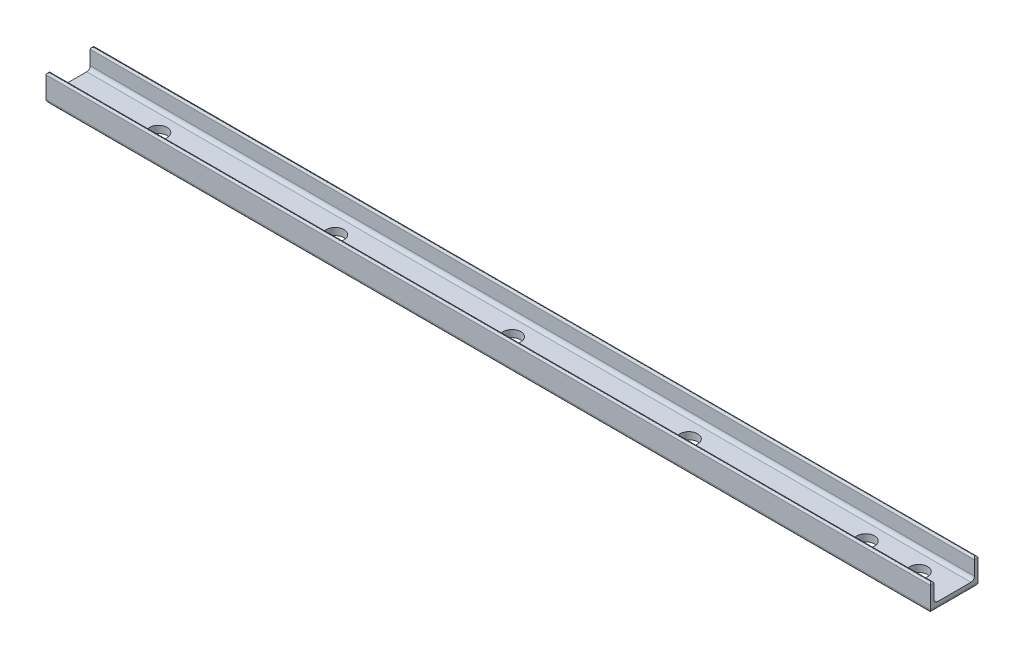
ISO-10303-21;
HEADER;
FILE_DESCRIPTION(('STEP AP214'),'2;1');
FILE_NAME('part.step','',(''),(''),'','','');
FILE_SCHEMA(('AUTOMOTIVE_DESIGN { 1 0 10303 214 1 1 1 1 }'));
ENDSEC;
DATA;
#1=APPLICATION_CONTEXT('core data for automotive mechanical design processes');
#2=APPLICATION_PROTOCOL_DEFINITION('international standard','automotive_design',2000,#1);
#3=PRODUCT_CONTEXT('',#1,'mechanical');
#4=PRODUCT('Part','Part','',(#3));
#5=PRODUCT_RELATED_PRODUCT_CATEGORY('part','',(#4));
#6=PRODUCT_DEFINITION_FORMATION('','',#4);
#7=PRODUCT_DEFINITION_CONTEXT('part definition',#1,'design');
#8=PRODUCT_DEFINITION('design','',#6,#7);
#9=PRODUCT_DEFINITION_SHAPE('','',#8);
#10=(LENGTH_UNIT() NAMED_UNIT(*) SI_UNIT(.MILLI.,.METRE.));
#11=(NAMED_UNIT(*) PLANE_ANGLE_UNIT() SI_UNIT($,.RADIAN.));
#12=(NAMED_UNIT(*) SI_UNIT($,.STERADIAN.) SOLID_ANGLE_UNIT());
#13=UNCERTAINTY_MEASURE_WITH_UNIT(LENGTH_MEASURE(1.E-05),#10,'distance_accuracy_value','');
#14=(GEOMETRIC_REPRESENTATION_CONTEXT(3) GLOBAL_UNCERTAINTY_ASSIGNED_CONTEXT((#13)) GLOBAL_UNIT_ASSIGNED_CONTEXT((#10,
#11,#12)) REPRESENTATION_CONTEXT('',''));
#15=CARTESIAN_POINT('',(0.,0.,0.));
#16=DIRECTION('',(0.,0.,1.));
#17=DIRECTION('',(1.,0.,0.));
#18=AXIS2_PLACEMENT_3D('',#15,#16,#17);
#19=CARTESIAN_POINT('',(0.,2.,0.));
#20=DIRECTION('',(0.,1.,0.));
#21=DIRECTION('',(0.,0.,1.));
#22=AXIS2_PLACEMENT_3D('',#19,#20,#21);
#23=PLANE('',#22);
#24=CARTESIAN_POINT('',(100.,2.,0.));
#25=DIRECTION('',(0.,1.,0.));
#26=DIRECTION('',(0.,0.,1.));
#27=AXIS2_PLACEMENT_3D('',#24,#25,#26);
#28=CIRCLE('',#27,2.5);
#29=CARTESIAN_POINT('',(100.,2.,2.5));
#30=VERTEX_POINT('',#29);
#31=EDGE_CURVE('E232',#30,#30,#28,.T.);
#32=ORIENTED_EDGE('',*,*,#31,.F.);
#33=EDGE_LOOP('',(#32));
#34=FACE_BOUND('',#33,.T.);
#35=CARTESIAN_POINT('',(-100.,2.,0.));
#36=DIRECTION('',(0.,1.,0.));
#37=DIRECTION('',(0.,0.,1.));
#38=AXIS2_PLACEMENT_3D('',#35,#36,#37);
#39=CIRCLE('',#38,2.5);
#40=CARTESIAN_POINT('',(-100.,2.,2.5));
#41=VERTEX_POINT('',#40);
#42=EDGE_CURVE('E220',#41,#41,#39,.T.);
#43=ORIENTED_EDGE('',*,*,#42,.F.);
#44=EDGE_LOOP('',(#43));
#45=FACE_BOUND('',#44,.T.);
#46=CARTESIAN_POINT('',(-1.80411241501588E-13,2.,0.));
#47=DIRECTION('',(0.,1.,0.));
#48=DIRECTION('',(0.,0.,1.));
#49=AXIS2_PLACEMENT_3D('',#46,#47,#48);
#50=CIRCLE('',#49,2.5);
#51=CARTESIAN_POINT('',(-1.80411241501588E-13,2.,2.5));
#52=VERTEX_POINT('',#51);
#53=EDGE_CURVE('E210',#52,#52,#50,.T.);
#54=ORIENTED_EDGE('',*,*,#53,.F.);
#55=EDGE_LOOP('',(#54));
#56=FACE_BOUND('',#55,.T.);
#57=CARTESIAN_POINT('',(-50.,2.,0.));
#58=DIRECTION('',(0.,1.,0.));
#59=DIRECTION('',(0.,0.,1.));
#60=AXIS2_PLACEMENT_3D('',#57,#58,#59);
#61=CIRCLE('',#60,2.5);
#62=CARTESIAN_POINT('',(-50.,2.,2.5));
#63=VERTEX_POINT('',#62);
#64=EDGE_CURVE('E214',#63,#63,#61,.T.);
#65=ORIENTED_EDGE('',*,*,#64,.F.);
#66=EDGE_LOOP('',(#65));
#67=FACE_BOUND('',#66,.T.);
#68=CARTESIAN_POINT('',(50.,2.,0.));
#69=DIRECTION('',(0.,1.,0.));
#70=DIRECTION('',(0.,0.,1.));
#71=AXIS2_PLACEMENT_3D('',#68,#69,#70);
#72=CIRCLE('',#71,2.5);
#73=CARTESIAN_POINT('',(50.,2.,2.5));
#74=VERTEX_POINT('',#73);
#75=EDGE_CURVE('E226',#74,#74,#72,.T.);
#76=ORIENTED_EDGE('',*,*,#75,.F.);
#77=EDGE_LOOP('',(#76));
#78=FACE_BOUND('',#77,.T.);
#79=CARTESIAN_POINT('',(115.,2.,0.));
#80=DIRECTION('',(0.,1.,0.));
#81=DIRECTION('',(0.,0.,1.));
#82=AXIS2_PLACEMENT_3D('',#79,#80,#81);
#83=CIRCLE('',#82,2.49999999999999);
#84=CARTESIAN_POINT('',(115.,2.,2.49999999999999));
#85=VERTEX_POINT('',#84);
#86=EDGE_CURVE('E238',#85,#85,#83,.T.);
#87=ORIENTED_EDGE('',*,*,#86,.F.);
#88=EDGE_LOOP('',(#87));
#89=FACE_BOUND('',#88,.T.);
#90=DIRECTION('',(0.,0.,1.));
#91=VECTOR('',#90,1.);
#92=CARTESIAN_POINT('',(-125.,2.,-6.75));
#93=LINE('',#92,#91);
#94=CARTESIAN_POINT('',(-125.,2.,-4.75));
#95=VERTEX_POINT('',#94);
#96=CARTESIAN_POINT('',(-125.,2.,4.75));
#97=VERTEX_POINT('',#96);
#98=EDGE_CURVE('E204',#95,#97,#93,.T.);
#99=ORIENTED_EDGE('',*,*,#98,.T.);
#100=DIRECTION('',(-1.,0.,0.));
#101=VECTOR('',#100,1.);
#102=CARTESIAN_POINT('',(0.,2.,4.75));
#103=LINE('',#102,#101);
#104=CARTESIAN_POINT('',(125.,2.,4.75));
#105=VERTEX_POINT('',#104);
#106=EDGE_CURVE('E168',#97,#105,#103,.F.);
#107=ORIENTED_EDGE('',*,*,#106,.T.);
#108=DIRECTION('',(0.,0.,-1.));
#109=VECTOR('',#108,1.);
#110=CARTESIAN_POINT('',(125.,2.,-6.75));
#111=LINE('',#110,#109);
#112=CARTESIAN_POINT('',(125.,2.,-4.75));
#113=VERTEX_POINT('',#112);
#114=EDGE_CURVE('E207',#105,#113,#111,.T.);
#115=ORIENTED_EDGE('',*,*,#114,.T.);
#116=DIRECTION('',(1.,0.,0.));
#117=VECTOR('',#116,1.);
#118=CARTESIAN_POINT('',(0.,2.,-4.75));
#119=LINE('',#118,#117);
#120=EDGE_CURVE('E171',#113,#95,#119,.F.);
#121=ORIENTED_EDGE('',*,*,#120,.T.);
#122=EDGE_LOOP('',(#99,#107,#115,#121));
#123=FACE_BOUND('',#122,.T.);
#124=ADVANCED_FACE('F39',(#34,#45,#56,#67,#78,#89,#123),#23,.T.);
#125=CARTESIAN_POINT('',(0.,0.,0.));
#126=DIRECTION('',(0.,1.,0.));
#127=DIRECTION('',(0.,0.,1.));
#128=AXIS2_PLACEMENT_3D('',#125,#126,#127);
#129=PLANE('',#128);
#130=DIRECTION('',(0.,0.,1.));
#131=VECTOR('',#130,1.);
#132=CARTESIAN_POINT('',(-124.,0.,5.09880203901925E-13));
#133=LINE('',#132,#131);
#134=CARTESIAN_POINT('',(-124.,0.,5.75));
#135=VERTEX_POINT('',#134);
#136=CARTESIAN_POINT('',(-124.,0.,-5.75));
#137=VERTEX_POINT('',#136);
#138=EDGE_CURVE('E183',#135,#137,#133,.F.);
#139=ORIENTED_EDGE('',*,*,#138,.T.);
#140=DIRECTION('',(-1.,0.,0.));
#141=VECTOR('',#140,1.);
#142=CARTESIAN_POINT('',(0.,0.,-5.75));
#143=LINE('',#142,#141);
#144=CARTESIAN_POINT('',(124.,0.,-5.75));
#145=VERTEX_POINT('',#144);
#146=EDGE_CURVE('E177',#137,#145,#143,.F.);
#147=ORIENTED_EDGE('',*,*,#146,.T.);
#148=DIRECTION('',(0.,0.,-1.));
#149=VECTOR('',#148,1.);
#150=CARTESIAN_POINT('',(124.,0.,0.));
#151=LINE('',#150,#149);
#152=CARTESIAN_POINT('',(124.,0.,5.75));
#153=VERTEX_POINT('',#152);
#154=EDGE_CURVE('E180',#145,#153,#151,.F.);
#155=ORIENTED_EDGE('',*,*,#154,.T.);
#156=DIRECTION('',(1.,0.,0.));
#157=VECTOR('',#156,1.);
#158=CARTESIAN_POINT('',(0.,0.,5.75));
#159=LINE('',#158,#157);
#160=EDGE_CURVE('E186',#153,#135,#159,.F.);
#161=ORIENTED_EDGE('',*,*,#160,.T.);
#162=EDGE_LOOP('',(#139,#147,#155,#161));
#163=FACE_BOUND('',#162,.T.);
#164=CARTESIAN_POINT('',(-1.80411241501588E-13,0.,0.));
#165=DIRECTION('',(0.,1.,0.));
#166=DIRECTION('',(0.,0.,1.));
#167=AXIS2_PLACEMENT_3D('',#164,#165,#166);
#168=CIRCLE('',#167,2.5);
#169=CARTESIAN_POINT('',(-1.80411241501588E-13,0.,2.5));
#170=VERTEX_POINT('',#169);
#171=EDGE_CURVE('E211',#170,#170,#168,.T.);
#172=ORIENTED_EDGE('',*,*,#171,.T.);
#173=EDGE_LOOP('',(#172));
#174=FACE_BOUND('',#173,.T.);
#175=CARTESIAN_POINT('',(-50.,0.,0.));
#176=DIRECTION('',(0.,1.,0.));
#177=DIRECTION('',(0.,0.,1.));
#178=AXIS2_PLACEMENT_3D('',#175,#176,#177);
#179=CIRCLE('',#178,2.5);
#180=CARTESIAN_POINT('',(-50.,0.,2.5));
#181=VERTEX_POINT('',#180);
#182=EDGE_CURVE('E217',#181,#181,#179,.T.);
#183=ORIENTED_EDGE('',*,*,#182,.T.);
#184=EDGE_LOOP('',(#183));
#185=FACE_BOUND('',#184,.T.);
#186=CARTESIAN_POINT('',(-100.,0.,0.));
#187=DIRECTION('',(0.,1.,0.));
#188=DIRECTION('',(0.,0.,1.));
#189=AXIS2_PLACEMENT_3D('',#186,#187,#188);
#190=CIRCLE('',#189,2.5);
#191=CARTESIAN_POINT('',(-100.,0.,2.5));
#192=VERTEX_POINT('',#191);
#193=EDGE_CURVE('E223',#192,#192,#190,.T.);
#194=ORIENTED_EDGE('',*,*,#193,.T.);
#195=EDGE_LOOP('',(#194));
#196=FACE_BOUND('',#195,.T.);
#197=CARTESIAN_POINT('',(50.,0.,0.));
#198=DIRECTION('',(0.,1.,0.));
#199=DIRECTION('',(0.,0.,1.));
#200=AXIS2_PLACEMENT_3D('',#197,#198,#199);
#201=CIRCLE('',#200,2.5);
#202=CARTESIAN_POINT('',(50.,0.,2.5));
#203=VERTEX_POINT('',#202);
#204=EDGE_CURVE('E229',#203,#203,#201,.T.);
#205=ORIENTED_EDGE('',*,*,#204,.T.);
#206=EDGE_LOOP('',(#205));
#207=FACE_BOUND('',#206,.T.);
#208=CARTESIAN_POINT('',(100.,0.,0.));
#209=DIRECTION('',(0.,1.,0.));
#210=DIRECTION('',(0.,0.,1.));
#211=AXIS2_PLACEMENT_3D('',#208,#209,#210);
#212=CIRCLE('',#211,2.5);
#213=CARTESIAN_POINT('',(100.,0.,2.5));
#214=VERTEX_POINT('',#213);
#215=EDGE_CURVE('E235',#214,#214,#212,.T.);
#216=ORIENTED_EDGE('',*,*,#215,.T.);
#217=EDGE_LOOP('',(#216));
#218=FACE_BOUND('',#217,.T.);
#219=CARTESIAN_POINT('',(115.,0.,0.));
#220=DIRECTION('',(0.,1.,0.));
#221=DIRECTION('',(0.,0.,1.));
#222=AXIS2_PLACEMENT_3D('',#219,#220,#221);
#223=CIRCLE('',#222,2.49999999999999);
#224=CARTESIAN_POINT('',(115.,0.,2.49999999999999));
#225=VERTEX_POINT('',#224);
#226=EDGE_CURVE('E241',#225,#225,#223,.T.);
#227=ORIENTED_EDGE('',*,*,#226,.T.);
#228=EDGE_LOOP('',(#227));
#229=FACE_BOUND('',#228,.T.);
#230=ADVANCED_FACE('F363',(#163,#174,#185,#196,#207,#218,#229),#129,.F.);
#231=CARTESIAN_POINT('',(125.,2.,-6.75));
#232=DIRECTION('',(-1.,0.,0.));
#233=DIRECTION('',(0.,0.,1.));
#234=AXIS2_PLACEMENT_3D('',#231,#232,#233);
#235=PLANE('',#234);
#236=DIRECTION('',(0.,-1.,0.));
#237=VECTOR('',#236,1.);
#238=CARTESIAN_POINT('',(125.,7.5,5.75));
#239=LINE('',#238,#237);
#240=CARTESIAN_POINT('',(125.,7.,5.75));
#241=VERTEX_POINT('',#240);
#242=CARTESIAN_POINT('',(125.,3.,5.75));
#243=VERTEX_POINT('',#242);
#244=EDGE_CURVE('E136',#241,#243,#239,.T.);
#245=ORIENTED_EDGE('',*,*,#244,.F.);
#246=DIRECTION('',(0.,0.,-1.));
#247=VECTOR('',#246,1.);
#248=CARTESIAN_POINT('',(125.,7.,-6.75));
#249=LINE('',#248,#247);
#250=CARTESIAN_POINT('',(125.,7.,6.75));
#251=VERTEX_POINT('',#250);
#252=EDGE_CURVE('E125',#241,#251,#249,.F.);
#253=ORIENTED_EDGE('',*,*,#252,.T.);
#254=DIRECTION('',(0.,-1.,0.));
#255=VECTOR('',#254,1.);
#256=CARTESIAN_POINT('',(125.,2.,6.75));
#257=LINE('',#256,#255);
#258=CARTESIAN_POINT('',(125.,1.,6.75));
#259=VERTEX_POINT('',#258);
#260=EDGE_CURVE('E201',#251,#259,#257,.T.);
#261=ORIENTED_EDGE('',*,*,#260,.T.);
#262=DIRECTION('',(0.,0.,-1.));
#263=VECTOR('',#262,1.);
#264=CARTESIAN_POINT('',(125.,1.,-6.75));
#265=LINE('',#264,#263);
#266=CARTESIAN_POINT('',(125.,1.,-6.75));
#267=VERTEX_POINT('',#266);
#268=EDGE_CURVE('E189',#259,#267,#265,.T.);
#269=ORIENTED_EDGE('',*,*,#268,.T.);
#270=DIRECTION('',(0.,-1.,0.));
#271=VECTOR('',#270,1.);
#272=CARTESIAN_POINT('',(125.,2.,-6.75));
#273=LINE('',#272,#271);
#274=CARTESIAN_POINT('',(125.,7.,-6.75));
#275=VERTEX_POINT('',#274);
#276=EDGE_CURVE('E192',#275,#267,#273,.T.);
#277=ORIENTED_EDGE('',*,*,#276,.F.);
#278=DIRECTION('',(0.,0.,-1.));
#279=VECTOR('',#278,1.);
#280=CARTESIAN_POINT('',(125.,7.,-5.75));
#281=LINE('',#280,#279);
#282=CARTESIAN_POINT('',(125.,7.,-5.75));
#283=VERTEX_POINT('',#282);
#284=EDGE_CURVE('E93',#275,#283,#281,.F.);
#285=ORIENTED_EDGE('',*,*,#284,.T.);
#286=DIRECTION('',(0.,-1.,0.));
#287=VECTOR('',#286,1.);
#288=CARTESIAN_POINT('',(125.,7.5,-5.75));
#289=LINE('',#288,#287);
#290=CARTESIAN_POINT('',(125.,3.,-5.75));
#291=VERTEX_POINT('',#290);
#292=EDGE_CURVE('E248',#283,#291,#289,.T.);
#293=ORIENTED_EDGE('',*,*,#292,.T.);
#294=CARTESIAN_POINT('',(125.,3.,-4.75));
#295=DIRECTION('',(-1.,0.,0.));
#296=DIRECTION('',(0.,0.,1.));
#297=AXIS2_PLACEMENT_3D('',#294,#295,#296);
#298=CIRCLE('',#297,1.);
#299=EDGE_CURVE('E147',#291,#113,#298,.T.);
#300=ORIENTED_EDGE('',*,*,#299,.T.);
#301=ORIENTED_EDGE('',*,*,#114,.F.);
#302=CARTESIAN_POINT('',(125.,3.,4.75));
#303=DIRECTION('',(-1.,0.,0.));
#304=DIRECTION('',(0.,0.,1.));
#305=AXIS2_PLACEMENT_3D('',#302,#303,#304);
#306=CIRCLE('',#305,1.);
#307=EDGE_CURVE('E150',#105,#243,#306,.T.);
#308=ORIENTED_EDGE('',*,*,#307,.T.);
#309=EDGE_LOOP('',(#245,#253,#261,#269,#277,#285,#293,#300,#301,#308));
#310=FACE_BOUND('',#309,.T.);
#311=ADVANCED_FACE('F270',(#310),#235,.F.);
#312=CARTESIAN_POINT('',(-125.,2.,-6.75));
#313=DIRECTION('',(0.,0.,1.));
#314=DIRECTION('',(1.,0.,0.));
#315=AXIS2_PLACEMENT_3D('',#312,#313,#314);
#316=PLANE('',#315);
#317=DIRECTION('',(0.,-1.,0.));
#318=VECTOR('',#317,1.);
#319=CARTESIAN_POINT('',(-125.,2.,-6.75));
#320=LINE('',#319,#318);
#321=CARTESIAN_POINT('',(-125.,7.,-6.75));
#322=VERTEX_POINT('',#321);
#323=CARTESIAN_POINT('',(-125.,1.,-6.75));
#324=VERTEX_POINT('',#323);
#325=EDGE_CURVE('E195',#322,#324,#320,.T.);
#326=ORIENTED_EDGE('',*,*,#325,.F.);
#327=DIRECTION('',(-1.,0.,0.));
#328=VECTOR('',#327,1.);
#329=CARTESIAN_POINT('',(125.,7.,-6.75));
#330=LINE('',#329,#328);
#331=EDGE_CURVE('E49',#322,#275,#330,.F.);
#332=ORIENTED_EDGE('',*,*,#331,.T.);
#333=ORIENTED_EDGE('',*,*,#276,.T.);
#334=DIRECTION('',(-1.,0.,0.));
#335=VECTOR('',#334,1.);
#336=CARTESIAN_POINT('',(-125.,1.,-6.75));
#337=LINE('',#336,#335);
#338=EDGE_CURVE('E159',#267,#324,#337,.T.);
#339=ORIENTED_EDGE('',*,*,#338,.T.);
#340=EDGE_LOOP('',(#326,#332,#333,#339));
#341=FACE_BOUND('',#340,.T.);
#342=ADVANCED_FACE('F358',(#341),#316,.F.);
#343=CARTESIAN_POINT('',(-125.,2.,-6.75));
#344=DIRECTION('',(1.,0.,0.));
#345=DIRECTION('',(0.,0.,-1.));
#346=AXIS2_PLACEMENT_3D('',#343,#344,#345);
#347=PLANE('',#346);
#348=DIRECTION('',(0.,-1.,0.));
#349=VECTOR('',#348,1.);
#350=CARTESIAN_POINT('',(-125.,2.,6.75));
#351=LINE('',#350,#349);
#352=CARTESIAN_POINT('',(-125.,7.,6.75));
#353=VERTEX_POINT('',#352);
#354=CARTESIAN_POINT('',(-125.,1.,6.75));
#355=VERTEX_POINT('',#354);
#356=EDGE_CURVE('E198',#353,#355,#351,.T.);
#357=ORIENTED_EDGE('',*,*,#356,.F.);
#358=DIRECTION('',(0.,0.,1.));
#359=VECTOR('',#358,1.);
#360=CARTESIAN_POINT('',(-125.,7.,-6.75));
#361=LINE('',#360,#359);
#362=CARTESIAN_POINT('',(-125.,7.,5.75));
#363=VERTEX_POINT('',#362);
#364=EDGE_CURVE('E117',#353,#363,#361,.F.);
#365=ORIENTED_EDGE('',*,*,#364,.T.);
#366=DIRECTION('',(0.,-1.,0.));
#367=VECTOR('',#366,1.);
#368=CARTESIAN_POINT('',(-125.,7.5,5.75));
#369=LINE('',#368,#367);
#370=CARTESIAN_POINT('',(-125.,3.,5.75));
#371=VERTEX_POINT('',#370);
#372=EDGE_CURVE('E251',#363,#371,#369,.T.);
#373=ORIENTED_EDGE('',*,*,#372,.T.);
#374=CARTESIAN_POINT('',(-125.,3.,4.75));
#375=DIRECTION('',(1.,0.,0.));
#376=DIRECTION('',(0.,0.,-1.));
#377=AXIS2_PLACEMENT_3D('',#374,#375,#376);
#378=CIRCLE('',#377,1.);
#379=EDGE_CURVE('E153',#371,#97,#378,.T.);
#380=ORIENTED_EDGE('',*,*,#379,.T.);
#381=ORIENTED_EDGE('',*,*,#98,.F.);
#382=CARTESIAN_POINT('',(-125.,3.,-4.75));
#383=DIRECTION('',(1.,0.,0.));
#384=DIRECTION('',(0.,0.,-1.));
#385=AXIS2_PLACEMENT_3D('',#382,#383,#384);
#386=CIRCLE('',#385,1.);
#387=CARTESIAN_POINT('',(-125.,3.,-5.75));
#388=VERTEX_POINT('',#387);
#389=EDGE_CURVE('E132',#95,#388,#386,.T.);
#390=ORIENTED_EDGE('',*,*,#389,.T.);
#391=DIRECTION('',(0.,-1.,0.));
#392=VECTOR('',#391,1.);
#393=CARTESIAN_POINT('',(-125.,7.5,-5.75));
#394=LINE('',#393,#392);
#395=CARTESIAN_POINT('',(-125.,7.,-5.75));
#396=VERTEX_POINT('',#395);
#397=EDGE_CURVE('E244',#396,#388,#394,.T.);
#398=ORIENTED_EDGE('',*,*,#397,.F.);
#399=DIRECTION('',(0.,0.,1.));
#400=VECTOR('',#399,1.);
#401=CARTESIAN_POINT('',(-125.,7.,-6.75));
#402=LINE('',#401,#400);
#403=EDGE_CURVE('E120',#396,#322,#402,.F.);
#404=ORIENTED_EDGE('',*,*,#403,.T.);
#405=ORIENTED_EDGE('',*,*,#325,.T.);
#406=DIRECTION('',(0.,0.,1.));
#407=VECTOR('',#406,1.);
#408=CARTESIAN_POINT('',(-125.,1.,-6.75));
#409=LINE('',#408,#407);
#410=EDGE_CURVE('E162',#324,#355,#409,.T.);
#411=ORIENTED_EDGE('',*,*,#410,.T.);
#412=EDGE_LOOP('',(#357,#365,#373,#380,#381,#390,#398,#404,#405,#411));
#413=FACE_BOUND('',#412,.T.);
#414=ADVANCED_FACE('F283',(#413),#347,.F.);
#415=CARTESIAN_POINT('',(-125.,2.,6.75));
#416=DIRECTION('',(0.,0.,-1.));
#417=DIRECTION('',(-1.,0.,0.));
#418=AXIS2_PLACEMENT_3D('',#415,#416,#417);
#419=PLANE('',#418);
#420=ORIENTED_EDGE('',*,*,#260,.F.);
#421=DIRECTION('',(1.,0.,0.));
#422=VECTOR('',#421,1.);
#423=CARTESIAN_POINT('',(-125.,7.,6.75));
#424=LINE('',#423,#422);
#425=EDGE_CURVE('E122',#251,#353,#424,.F.);
#426=ORIENTED_EDGE('',*,*,#425,.T.);
#427=ORIENTED_EDGE('',*,*,#356,.T.);
#428=DIRECTION('',(1.,0.,0.));
#429=VECTOR('',#428,1.);
#430=CARTESIAN_POINT('',(-125.,1.,6.75));
#431=LINE('',#430,#429);
#432=EDGE_CURVE('E156',#355,#259,#431,.T.);
#433=ORIENTED_EDGE('',*,*,#432,.T.);
#434=EDGE_LOOP('',(#420,#426,#427,#433));
#435=FACE_BOUND('',#434,.T.);
#436=ADVANCED_FACE('F321',(#435),#419,.F.);
#437=CARTESIAN_POINT('',(-1.80411241501588E-13,2.,0.));
#438=DIRECTION('',(0.,-1.,0.));
#439=DIRECTION('',(0.,0.,-1.));
#440=AXIS2_PLACEMENT_3D('',#437,#438,#439);
#441=CYLINDRICAL_SURFACE('',#440,2.5);
#442=ORIENTED_EDGE('',*,*,#53,.T.);
#443=EDGE_LOOP('',(#442));
#444=FACE_BOUND('',#443,.T.);
#445=ORIENTED_EDGE('',*,*,#171,.F.);
#446=EDGE_LOOP('',(#445));
#447=FACE_BOUND('',#446,.T.);
#448=ADVANCED_FACE('F401',(#444,#447),#441,.F.);
#449=CARTESIAN_POINT('',(-50.,2.,0.));
#450=DIRECTION('',(0.,-1.,0.));
#451=DIRECTION('',(0.,0.,-1.));
#452=AXIS2_PLACEMENT_3D('',#449,#450,#451);
#453=CYLINDRICAL_SURFACE('',#452,2.5);
#454=ORIENTED_EDGE('',*,*,#64,.T.);
#455=EDGE_LOOP('',(#454));
#456=FACE_BOUND('',#455,.T.);
#457=ORIENTED_EDGE('',*,*,#182,.F.);
#458=EDGE_LOOP('',(#457));
#459=FACE_BOUND('',#458,.T.);
#460=ADVANCED_FACE('F562',(#456,#459),#453,.F.);
#461=CARTESIAN_POINT('',(-100.,2.,0.));
#462=DIRECTION('',(0.,-1.,0.));
#463=DIRECTION('',(0.,0.,-1.));
#464=AXIS2_PLACEMENT_3D('',#461,#462,#463);
#465=CYLINDRICAL_SURFACE('',#464,2.5);
#466=ORIENTED_EDGE('',*,*,#42,.T.);
#467=EDGE_LOOP('',(#466));
#468=FACE_BOUND('',#467,.T.);
#469=ORIENTED_EDGE('',*,*,#193,.F.);
#470=EDGE_LOOP('',(#469));
#471=FACE_BOUND('',#470,.T.);
#472=ADVANCED_FACE('F571',(#468,#471),#465,.F.);
#473=CARTESIAN_POINT('',(50.,2.,0.));
#474=DIRECTION('',(0.,-1.,0.));
#475=DIRECTION('',(0.,0.,-1.));
#476=AXIS2_PLACEMENT_3D('',#473,#474,#475);
#477=CYLINDRICAL_SURFACE('',#476,2.5);
#478=ORIENTED_EDGE('',*,*,#75,.T.);
#479=EDGE_LOOP('',(#478));
#480=FACE_BOUND('',#479,.T.);
#481=ORIENTED_EDGE('',*,*,#204,.F.);
#482=EDGE_LOOP('',(#481));
#483=FACE_BOUND('',#482,.T.);
#484=ADVANCED_FACE('F391',(#480,#483),#477,.F.);
#485=CARTESIAN_POINT('',(100.,2.,0.));
#486=DIRECTION('',(0.,-1.,0.));
#487=DIRECTION('',(0.,0.,-1.));
#488=AXIS2_PLACEMENT_3D('',#485,#486,#487);
#489=CYLINDRICAL_SURFACE('',#488,2.5);
#490=ORIENTED_EDGE('',*,*,#31,.T.);
#491=EDGE_LOOP('',(#490));
#492=FACE_BOUND('',#491,.T.);
#493=ORIENTED_EDGE('',*,*,#215,.F.);
#494=EDGE_LOOP('',(#493));
#495=FACE_BOUND('',#494,.T.);
#496=ADVANCED_FACE('F382',(#492,#495),#489,.F.);
#497=CARTESIAN_POINT('',(115.,2.,0.));
#498=DIRECTION('',(0.,-1.,0.));
#499=DIRECTION('',(0.,0.,-1.));
#500=AXIS2_PLACEMENT_3D('',#497,#498,#499);
#501=CYLINDRICAL_SURFACE('',#500,2.49999999999999);
#502=ORIENTED_EDGE('',*,*,#86,.T.);
#503=EDGE_LOOP('',(#502));
#504=FACE_BOUND('',#503,.T.);
#505=ORIENTED_EDGE('',*,*,#226,.F.);
#506=EDGE_LOOP('',(#505));
#507=FACE_BOUND('',#506,.T.);
#508=ADVANCED_FACE('F379',(#504,#507),#501,.F.);
#509=CARTESIAN_POINT('',(-125.,7.5,-5.75));
#510=DIRECTION('',(0.,0.,-1.));
#511=DIRECTION('',(-1.,0.,0.));
#512=AXIS2_PLACEMENT_3D('',#509,#510,#511);
#513=PLANE('',#512);
#514=ORIENTED_EDGE('',*,*,#292,.F.);
#515=DIRECTION('',(1.,0.,0.));
#516=VECTOR('',#515,1.);
#517=CARTESIAN_POINT('',(-125.,7.,-5.75));
#518=LINE('',#517,#516);
#519=EDGE_CURVE('E11',#283,#396,#518,.F.);
#520=ORIENTED_EDGE('',*,*,#519,.T.);
#521=ORIENTED_EDGE('',*,*,#397,.T.);
#522=DIRECTION('',(1.,0.,0.));
#523=VECTOR('',#522,1.);
#524=CARTESIAN_POINT('',(-125.,3.,-5.75));
#525=LINE('',#524,#523);
#526=EDGE_CURVE('E165',#388,#291,#525,.T.);
#527=ORIENTED_EDGE('',*,*,#526,.T.);
#528=EDGE_LOOP('',(#514,#520,#521,#527));
#529=FACE_BOUND('',#528,.T.);
#530=ADVANCED_FACE('F381',(#529),#513,.F.);
#531=CARTESIAN_POINT('',(-125.,7.5,5.75));
#532=DIRECTION('',(0.,0.,1.));
#533=DIRECTION('',(1.,0.,0.));
#534=AXIS2_PLACEMENT_3D('',#531,#532,#533);
#535=PLANE('',#534);
#536=ORIENTED_EDGE('',*,*,#372,.F.);
#537=DIRECTION('',(-1.,0.,0.));
#538=VECTOR('',#537,1.);
#539=CARTESIAN_POINT('',(-125.,7.,5.75));
#540=LINE('',#539,#538);
#541=EDGE_CURVE('E129',#363,#241,#540,.F.);
#542=ORIENTED_EDGE('',*,*,#541,.T.);
#543=ORIENTED_EDGE('',*,*,#244,.T.);
#544=DIRECTION('',(-1.,0.,0.));
#545=VECTOR('',#544,1.);
#546=CARTESIAN_POINT('',(-125.,3.,5.75));
#547=LINE('',#546,#545);
#548=EDGE_CURVE('E174',#243,#371,#547,.T.);
#549=ORIENTED_EDGE('',*,*,#548,.T.);
#550=EDGE_LOOP('',(#536,#542,#543,#549));
#551=FACE_BOUND('',#550,.T.);
#552=ADVANCED_FACE('F259',(#551),#535,.F.);
#553=CARTESIAN_POINT('',(-124.,1.,-6.75000000000001));
#554=DIRECTION('',(0.,0.,1.));
#555=DIRECTION('',(1.,0.,0.));
#556=AXIS2_PLACEMENT_3D('',#553,#554,#555);
#557=CYLINDRICAL_SURFACE('',#556,1.);
#558=CARTESIAN_POINT('',(-124.,1.,-5.75));
#559=DIRECTION('',(-0.707106781186546,0.,0.707106781186549));
#560=DIRECTION('',(-0.707106781186549,0.,-0.707106781186546));
#561=AXIS2_PLACEMENT_3D('',#558,#559,#560);
#562=ELLIPSE('',#561,1.4142135623731,1.);
#563=EDGE_CURVE('E137',#137,#324,#562,.F.);
#564=ORIENTED_EDGE('',*,*,#563,.F.);
#565=ORIENTED_EDGE('',*,*,#138,.F.);
#566=CARTESIAN_POINT('',(-124.,1.,5.75));
#567=DIRECTION('',(0.707106781186549,0.,0.707106781186546));
#568=DIRECTION('',(0.707106781186546,0.,-0.707106781186549));
#569=AXIS2_PLACEMENT_3D('',#566,#567,#568);
#570=ELLIPSE('',#569,1.41421356237309,1.);
#571=EDGE_CURVE('E133',#355,#135,#570,.T.);
#572=ORIENTED_EDGE('',*,*,#571,.F.);
#573=ORIENTED_EDGE('',*,*,#410,.F.);
#574=EDGE_LOOP('',(#564,#565,#572,#573));
#575=FACE_BOUND('',#574,.T.);
#576=ADVANCED_FACE('F360',(#575),#557,.T.);
#577=CARTESIAN_POINT('',(-125.,1.,5.75));
#578=DIRECTION('',(1.,0.,0.));
#579=DIRECTION('',(0.,0.,-1.));
#580=AXIS2_PLACEMENT_3D('',#577,#578,#579);
#581=CYLINDRICAL_SURFACE('',#580,1.);
#582=ORIENTED_EDGE('',*,*,#571,.T.);
#583=ORIENTED_EDGE('',*,*,#160,.F.);
#584=CARTESIAN_POINT('',(124.,1.,5.75));
#585=DIRECTION('',(0.707106781186547,0.,-0.707106781186547));
#586=DIRECTION('',(0.707106781186547,0.,0.707106781186547));
#587=AXIS2_PLACEMENT_3D('',#584,#585,#586);
#588=ELLIPSE('',#587,1.41421356237309,1.);
#589=EDGE_CURVE('E140',#259,#153,#588,.T.);
#590=ORIENTED_EDGE('',*,*,#589,.F.);
#591=ORIENTED_EDGE('',*,*,#432,.F.);
#592=EDGE_LOOP('',(#582,#583,#590,#591));
#593=FACE_BOUND('',#592,.T.);
#594=ADVANCED_FACE('F345',(#593),#581,.T.);
#595=CARTESIAN_POINT('',(-125.,1.,-5.75));
#596=DIRECTION('',(-1.,0.,0.));
#597=DIRECTION('',(0.,0.,1.));
#598=AXIS2_PLACEMENT_3D('',#595,#596,#597);
#599=CYLINDRICAL_SURFACE('',#598,1.);
#600=ORIENTED_EDGE('',*,*,#563,.T.);
#601=ORIENTED_EDGE('',*,*,#338,.F.);
#602=CARTESIAN_POINT('',(124.,1.,-5.75));
#603=DIRECTION('',(-0.707106781186547,0.,-0.707106781186547));
#604=DIRECTION('',(-0.707106781186547,0.,0.707106781186547));
#605=AXIS2_PLACEMENT_3D('',#602,#603,#604);
#606=ELLIPSE('',#605,1.41421356237309,1.);
#607=EDGE_CURVE('E105',#145,#267,#606,.F.);
#608=ORIENTED_EDGE('',*,*,#607,.F.);
#609=ORIENTED_EDGE('',*,*,#146,.F.);
#610=EDGE_LOOP('',(#600,#601,#608,#609));
#611=FACE_BOUND('',#610,.T.);
#612=ADVANCED_FACE('F354',(#611),#599,.T.);
#613=CARTESIAN_POINT('',(124.,1.,-6.75));
#614=DIRECTION('',(0.,0.,-1.));
#615=DIRECTION('',(-1.,0.,0.));
#616=AXIS2_PLACEMENT_3D('',#613,#614,#615);
#617=CYLINDRICAL_SURFACE('',#616,1.);
#618=ORIENTED_EDGE('',*,*,#589,.T.);
#619=ORIENTED_EDGE('',*,*,#154,.F.);
#620=ORIENTED_EDGE('',*,*,#607,.T.);
#621=ORIENTED_EDGE('',*,*,#268,.F.);
#622=EDGE_LOOP('',(#618,#619,#620,#621));
#623=FACE_BOUND('',#622,.T.);
#624=ADVANCED_FACE('F348',(#623),#617,.T.);
#625=CARTESIAN_POINT('',(-125.,3.,4.75));
#626=DIRECTION('',(-1.,0.,0.));
#627=DIRECTION('',(0.,0.,1.));
#628=AXIS2_PLACEMENT_3D('',#625,#626,#627);
#629=CYLINDRICAL_SURFACE('',#628,1.);
#630=ORIENTED_EDGE('',*,*,#307,.F.);
#631=ORIENTED_EDGE('',*,*,#106,.F.);
#632=ORIENTED_EDGE('',*,*,#379,.F.);
#633=ORIENTED_EDGE('',*,*,#548,.F.);
#634=EDGE_LOOP('',(#630,#631,#632,#633));
#635=FACE_BOUND('',#634,.T.);
#636=ADVANCED_FACE('F275',(#635),#629,.F.);
#637=CARTESIAN_POINT('',(-125.,3.,-4.75));
#638=DIRECTION('',(1.,0.,0.));
#639=DIRECTION('',(0.,0.,-1.));
#640=AXIS2_PLACEMENT_3D('',#637,#638,#639);
#641=CYLINDRICAL_SURFACE('',#640,1.);
#642=ORIENTED_EDGE('',*,*,#389,.F.);
#643=ORIENTED_EDGE('',*,*,#120,.F.);
#644=ORIENTED_EDGE('',*,*,#299,.F.);
#645=ORIENTED_EDGE('',*,*,#526,.F.);
#646=EDGE_LOOP('',(#642,#643,#644,#645));
#647=FACE_BOUND('',#646,.T.);
#648=ADVANCED_FACE('F292',(#647),#641,.F.);
#649=CARTESIAN_POINT('',(124.5,7.,0.));
#650=DIRECTION('',(0.,0.,-1.));
#651=DIRECTION('',(-1.,0.,0.));
#652=AXIS2_PLACEMENT_3D('',#649,#650,#651);
#653=CYLINDRICAL_SURFACE('',#652,0.5);
#654=CARTESIAN_POINT('',(124.5,7.,6.25));
#655=DIRECTION('',(0.707106781186547,0.,-0.707106781186547));
#656=DIRECTION('',(0.707106781186547,0.,0.707106781186547));
#657=AXIS2_PLACEMENT_3D('',#654,#655,#656);
#658=ELLIPSE('',#657,0.707106781186547,0.5);
#659=CARTESIAN_POINT('',(124.5,7.5,6.25));
#660=VERTEX_POINT('',#659);
#661=EDGE_CURVE('E103',#251,#660,#658,.F.);
#662=ORIENTED_EDGE('',*,*,#661,.F.);
#663=ORIENTED_EDGE('',*,*,#252,.F.);
#664=CARTESIAN_POINT('',(124.5,7.,6.25));
#665=DIRECTION('',(-0.707106781186547,0.,-0.707106781186547));
#666=DIRECTION('',(0.707106781186547,0.,-0.707106781186547));
#667=AXIS2_PLACEMENT_3D('',#664,#665,#666);
#668=ELLIPSE('',#667,0.707106781186547,0.5);
#669=EDGE_CURVE('E108',#660,#241,#668,.T.);
#670=ORIENTED_EDGE('',*,*,#669,.F.);
#671=EDGE_LOOP('',(#662,#663,#670));
#672=FACE_BOUND('',#671,.T.);
#673=ADVANCED_FACE('F338',(#672),#653,.T.);
#674=CARTESIAN_POINT('',(0.,7.,6.25));
#675=DIRECTION('',(1.,0.,0.));
#676=DIRECTION('',(0.,0.,-1.));
#677=AXIS2_PLACEMENT_3D('',#674,#675,#676);
#678=CYLINDRICAL_SURFACE('',#677,0.5);
#679=CARTESIAN_POINT('',(-124.5,7.,6.25));
#680=DIRECTION('',(0.707106781186549,0.,0.707106781186546));
#681=DIRECTION('',(-0.707106781186546,0.,0.707106781186549));
#682=AXIS2_PLACEMENT_3D('',#679,#680,#681);
#683=ELLIPSE('',#682,0.707106781186546,0.5);
#684=CARTESIAN_POINT('',(-124.5,7.5,6.25));
#685=VERTEX_POINT('',#684);
#686=EDGE_CURVE('E106',#353,#685,#683,.F.);
#687=ORIENTED_EDGE('',*,*,#686,.F.);
#688=ORIENTED_EDGE('',*,*,#425,.F.);
#689=ORIENTED_EDGE('',*,*,#661,.T.);
#690=DIRECTION('',(1.,0.,0.));
#691=VECTOR('',#690,1.);
#692=CARTESIAN_POINT('',(0.,7.5,6.25));
#693=LINE('',#692,#691);
#694=EDGE_CURVE('E111',#685,#660,#693,.T.);
#695=ORIENTED_EDGE('',*,*,#694,.F.);
#696=EDGE_LOOP('',(#687,#688,#689,#695));
#697=FACE_BOUND('',#696,.T.);
#698=ADVANCED_FACE('F329',(#697),#678,.T.);
#699=CARTESIAN_POINT('',(-124.5,7.,5.11936172466045E-13));
#700=DIRECTION('',(0.,0.,1.));
#701=DIRECTION('',(1.,0.,0.));
#702=AXIS2_PLACEMENT_3D('',#699,#700,#701);
#703=CYLINDRICAL_SURFACE('',#702,0.5);
#704=ORIENTED_EDGE('',*,*,#364,.F.);
#705=ORIENTED_EDGE('',*,*,#686,.T.);
#706=CARTESIAN_POINT('',(-124.5,7.,6.25));
#707=DIRECTION('',(-0.707106781186546,0.,0.707106781186549));
#708=DIRECTION('',(0.707106781186549,0.,0.707106781186546));
#709=AXIS2_PLACEMENT_3D('',#706,#707,#708);
#710=ELLIPSE('',#709,0.707106781186549,0.5);
#711=EDGE_CURVE('E88',#363,#685,#710,.F.);
#712=ORIENTED_EDGE('',*,*,#711,.F.);
#713=EDGE_LOOP('',(#704,#705,#712));
#714=FACE_BOUND('',#713,.T.);
#715=ADVANCED_FACE('F332',(#714),#703,.T.);
#716=CARTESIAN_POINT('',(0.,7.,6.25));
#717=DIRECTION('',(-1.,0.,0.));
#718=DIRECTION('',(0.,0.,1.));
#719=AXIS2_PLACEMENT_3D('',#716,#717,#718);
#720=CYLINDRICAL_SURFACE('',#719,0.5);
#721=ORIENTED_EDGE('',*,*,#669,.T.);
#722=ORIENTED_EDGE('',*,*,#541,.F.);
#723=ORIENTED_EDGE('',*,*,#711,.T.);
#724=ORIENTED_EDGE('',*,*,#694,.T.);
#725=EDGE_LOOP('',(#721,#722,#723,#724));
#726=FACE_BOUND('',#725,.T.);
#727=ADVANCED_FACE('F334',(#726),#720,.T.);
#728=CARTESIAN_POINT('',(124.5,7.,0.));
#729=DIRECTION('',(0.,0.,1.));
#730=DIRECTION('',(1.,0.,0.));
#731=AXIS2_PLACEMENT_3D('',#728,#729,#730);
#732=CYLINDRICAL_SURFACE('',#731,0.5);
#733=CARTESIAN_POINT('',(124.5,7.,-6.25));
#734=DIRECTION('',(-0.707106781186547,0.,0.707106781186547));
#735=DIRECTION('',(-0.707106781186547,0.,-0.707106781186547));
#736=AXIS2_PLACEMENT_3D('',#733,#734,#735);
#737=ELLIPSE('',#736,0.707106781186547,0.5);
#738=CARTESIAN_POINT('',(124.5,7.5,-6.25));
#739=VERTEX_POINT('',#738);
#740=EDGE_CURVE('E43',#283,#739,#737,.T.);
#741=ORIENTED_EDGE('',*,*,#740,.F.);
#742=ORIENTED_EDGE('',*,*,#284,.F.);
#743=CARTESIAN_POINT('',(124.5,7.,-6.25));
#744=DIRECTION('',(0.707106781186547,0.,0.707106781186547));
#745=DIRECTION('',(-0.707106781186547,0.,0.707106781186547));
#746=AXIS2_PLACEMENT_3D('',#743,#744,#745);
#747=ELLIPSE('',#746,0.707106781186547,0.5);
#748=EDGE_CURVE('E90',#739,#275,#747,.F.);
#749=ORIENTED_EDGE('',*,*,#748,.F.);
#750=EDGE_LOOP('',(#741,#742,#749));
#751=FACE_BOUND('',#750,.T.);
#752=ADVANCED_FACE('F41',(#751),#732,.T.);
#753=CARTESIAN_POINT('',(0.,7.,-6.25));
#754=DIRECTION('',(-1.,0.,0.));
#755=DIRECTION('',(0.,0.,1.));
#756=AXIS2_PLACEMENT_3D('',#753,#754,#755);
#757=CYLINDRICAL_SURFACE('',#756,0.5);
#758=CARTESIAN_POINT('',(-124.5,7.,-6.25));
#759=DIRECTION('',(-0.707106781186549,0.,-0.707106781186546));
#760=DIRECTION('',(0.707106781186546,0.,-0.707106781186549));
#761=AXIS2_PLACEMENT_3D('',#758,#759,#760);
#762=ELLIPSE('',#761,0.707106781186546,0.5);
#763=CARTESIAN_POINT('',(-124.5,7.5,-6.25));
#764=VERTEX_POINT('',#763);
#765=EDGE_CURVE('E75',#396,#764,#762,.T.);
#766=ORIENTED_EDGE('',*,*,#765,.F.);
#767=ORIENTED_EDGE('',*,*,#519,.F.);
#768=ORIENTED_EDGE('',*,*,#740,.T.);
#769=DIRECTION('',(1.,0.,0.));
#770=VECTOR('',#769,1.);
#771=CARTESIAN_POINT('',(125.,7.5,-6.25));
#772=LINE('',#771,#770);
#773=EDGE_CURVE('E83',#764,#739,#772,.T.);
#774=ORIENTED_EDGE('',*,*,#773,.F.);
#775=EDGE_LOOP('',(#766,#767,#768,#774));
#776=FACE_BOUND('',#775,.T.);
#777=ADVANCED_FACE('F81',(#776),#757,.T.);
#778=CARTESIAN_POINT('',(-124.5,7.,5.11936172466045E-13));
#779=DIRECTION('',(0.,0.,-1.));
#780=DIRECTION('',(-1.,0.,0.));
#781=AXIS2_PLACEMENT_3D('',#778,#779,#780);
#782=CYLINDRICAL_SURFACE('',#781,0.5);
#783=ORIENTED_EDGE('',*,*,#403,.F.);
#784=ORIENTED_EDGE('',*,*,#765,.T.);
#785=CARTESIAN_POINT('',(-124.5,7.,-6.25));
#786=DIRECTION('',(0.707106781186546,0.,-0.707106781186549));
#787=DIRECTION('',(-0.707106781186549,0.,-0.707106781186546));
#788=AXIS2_PLACEMENT_3D('',#785,#786,#787);
#789=ELLIPSE('',#788,0.707106781186549,0.5);
#790=EDGE_CURVE('E99',#322,#764,#789,.T.);
#791=ORIENTED_EDGE('',*,*,#790,.F.);
#792=EDGE_LOOP('',(#783,#784,#791));
#793=FACE_BOUND('',#792,.T.);
#794=ADVANCED_FACE('F434',(#793),#782,.T.);
#795=CARTESIAN_POINT('',(0.,7.,-6.25));
#796=DIRECTION('',(1.,0.,0.));
#797=DIRECTION('',(0.,0.,-1.));
#798=AXIS2_PLACEMENT_3D('',#795,#796,#797);
#799=CYLINDRICAL_SURFACE('',#798,0.5);
#800=ORIENTED_EDGE('',*,*,#748,.T.);
#801=ORIENTED_EDGE('',*,*,#331,.F.);
#802=ORIENTED_EDGE('',*,*,#790,.T.);
#803=ORIENTED_EDGE('',*,*,#773,.T.);
#804=EDGE_LOOP('',(#800,#801,#802,#803));
#805=FACE_BOUND('',#804,.T.);
#806=ADVANCED_FACE('F98',(#805),#799,.T.);
#807=CLOSED_SHELL('',(#124,#230,#311,#342,#414,#436,#448,#460,#472,#484,#496,#508,#530,#552,
#576,#594,#612,#624,#636,#648,#673,#698,#715,#727,#752,#777,#794,#806));
#808=MANIFOLD_SOLID_BREP('B2',#807);
#809=ADVANCED_BREP_SHAPE_REPRESENTATION('',(#18,#808),#14);
#810=SHAPE_DEFINITION_REPRESENTATION(#9,#809);
ENDSEC;
END-ISO-10303-21;
